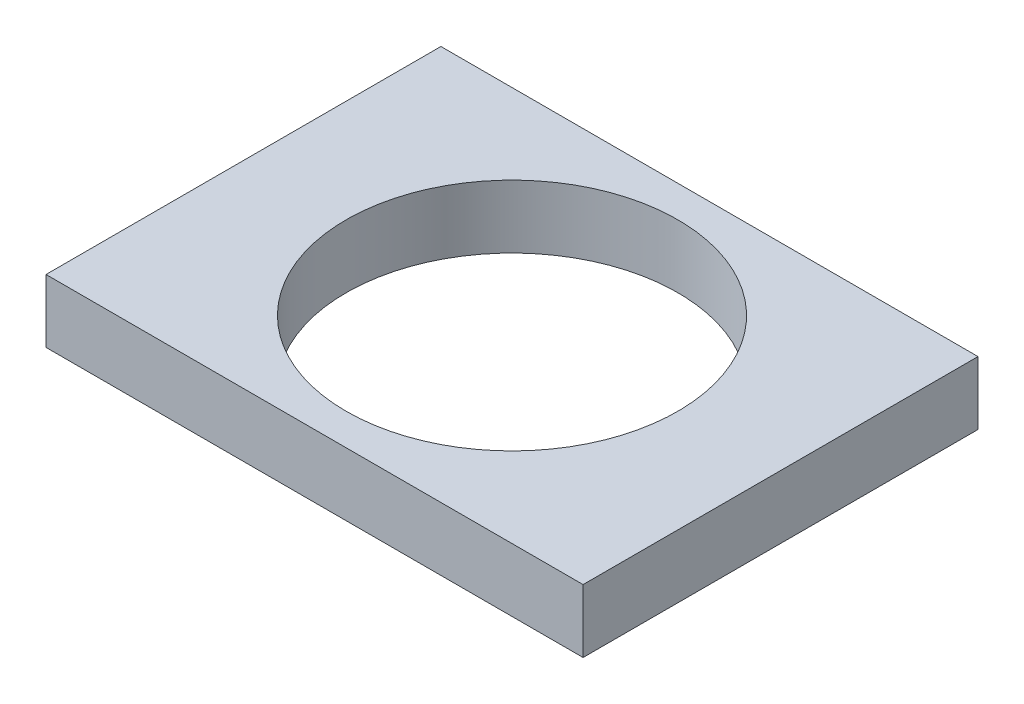
ISO-10303-21;
HEADER;
FILE_DESCRIPTION(('STEP AP214'),'2;1');
FILE_NAME('part.step','',(''),(''),'','','');
FILE_SCHEMA(('AUTOMOTIVE_DESIGN { 1 0 10303 214 1 1 1 1 }'));
ENDSEC;
DATA;
#1=APPLICATION_CONTEXT('core data for automotive mechanical design processes');
#2=APPLICATION_PROTOCOL_DEFINITION('international standard','automotive_design',2000,#1);
#3=PRODUCT_CONTEXT('',#1,'mechanical');
#4=PRODUCT('Part','Part','',(#3));
#5=PRODUCT_RELATED_PRODUCT_CATEGORY('part','',(#4));
#6=PRODUCT_DEFINITION_FORMATION('','',#4);
#7=PRODUCT_DEFINITION_CONTEXT('part definition',#1,'design');
#8=PRODUCT_DEFINITION('design','',#6,#7);
#9=PRODUCT_DEFINITION_SHAPE('','',#8);
#10=(LENGTH_UNIT() NAMED_UNIT(*) SI_UNIT(.MILLI.,.METRE.));
#11=(NAMED_UNIT(*) PLANE_ANGLE_UNIT() SI_UNIT($,.RADIAN.));
#12=(NAMED_UNIT(*) SI_UNIT($,.STERADIAN.) SOLID_ANGLE_UNIT());
#13=UNCERTAINTY_MEASURE_WITH_UNIT(LENGTH_MEASURE(1.E-05),#10,'distance_accuracy_value','');
#14=(GEOMETRIC_REPRESENTATION_CONTEXT(3) GLOBAL_UNCERTAINTY_ASSIGNED_CONTEXT((#13)) GLOBAL_UNIT_ASSIGNED_CONTEXT((#10,
#11,#12)) REPRESENTATION_CONTEXT('',''));
#15=CARTESIAN_POINT('',(0.,0.,0.));
#16=DIRECTION('',(0.,0.,1.));
#17=DIRECTION('',(1.,0.,0.));
#18=AXIS2_PLACEMENT_3D('',#15,#16,#17);
#19=CARTESIAN_POINT('',(0.,20.,0.));
#20=DIRECTION('',(0.,1.,0.));
#21=DIRECTION('',(0.,0.,1.));
#22=AXIS2_PLACEMENT_3D('',#19,#20,#21);
#23=PLANE('',#22);
#24=DIRECTION('',(1.,0.,0.));
#25=VECTOR('',#24,1.);
#26=CARTESIAN_POINT('',(-85.,20.,-62.5));
#27=LINE('',#26,#25);
#28=CARTESIAN_POINT('',(-85.,20.,-62.5));
#29=VERTEX_POINT('',#28);
#30=CARTESIAN_POINT('',(85.,20.,-62.5));
#31=VERTEX_POINT('',#30);
#32=EDGE_CURVE('E109',#29,#31,#27,.T.);
#33=ORIENTED_EDGE('',*,*,#32,.F.);
#34=DIRECTION('',(0.,0.,-1.));
#35=VECTOR('',#34,1.);
#36=CARTESIAN_POINT('',(-85.,20.,62.5));
#37=LINE('',#36,#35);
#38=CARTESIAN_POINT('',(-85.,20.,62.5));
#39=VERTEX_POINT('',#38);
#40=EDGE_CURVE('E99',#39,#29,#37,.T.);
#41=ORIENTED_EDGE('',*,*,#40,.F.);
#42=DIRECTION('',(1.,0.,0.));
#43=VECTOR('',#42,1.);
#44=CARTESIAN_POINT('',(-85.,20.,62.5));
#45=LINE('',#44,#43);
#46=CARTESIAN_POINT('',(85.,20.,62.5));
#47=VERTEX_POINT('',#46);
#48=EDGE_CURVE('E96',#39,#47,#45,.T.);
#49=ORIENTED_EDGE('',*,*,#48,.T.);
#50=DIRECTION('',(0.,0.,-1.));
#51=VECTOR('',#50,1.);
#52=CARTESIAN_POINT('',(85.,20.,62.5));
#53=LINE('',#52,#51);
#54=EDGE_CURVE('E93',#47,#31,#53,.T.);
#55=ORIENTED_EDGE('',*,*,#54,.T.);
#56=EDGE_LOOP('',(#33,#41,#49,#55));
#57=FACE_BOUND('',#56,.T.);
#58=CARTESIAN_POINT('',(0.,20.,0.));
#59=DIRECTION('',(0.,1.,0.));
#60=DIRECTION('',(0.,0.,1.));
#61=AXIS2_PLACEMENT_3D('',#58,#59,#60);
#62=CIRCLE('',#61,52.5);
#63=CARTESIAN_POINT('',(0.,20.,52.5));
#64=VERTEX_POINT('',#63);
#65=EDGE_CURVE('E120',#64,#64,#62,.T.);
#66=ORIENTED_EDGE('',*,*,#65,.F.);
#67=EDGE_LOOP('',(#66));
#68=FACE_BOUND('',#67,.T.);
#69=ADVANCED_FACE('F50',(#57,#68),#23,.T.);
#70=CARTESIAN_POINT('',(0.,0.,0.));
#71=DIRECTION('',(0.,1.,0.));
#72=DIRECTION('',(0.,0.,1.));
#73=AXIS2_PLACEMENT_3D('',#70,#71,#72);
#74=PLANE('',#73);
#75=DIRECTION('',(1.,0.,0.));
#76=VECTOR('',#75,1.);
#77=CARTESIAN_POINT('',(-85.,0.,-62.5));
#78=LINE('',#77,#76);
#79=CARTESIAN_POINT('',(-85.,0.,-62.5));
#80=VERTEX_POINT('',#79);
#81=CARTESIAN_POINT('',(85.,0.,-62.5));
#82=VERTEX_POINT('',#81);
#83=EDGE_CURVE('E116',#80,#82,#78,.T.);
#84=ORIENTED_EDGE('',*,*,#83,.T.);
#85=DIRECTION('',(0.,0.,-1.));
#86=VECTOR('',#85,1.);
#87=CARTESIAN_POINT('',(85.,0.,62.5));
#88=LINE('',#87,#86);
#89=CARTESIAN_POINT('',(85.,0.,62.5));
#90=VERTEX_POINT('',#89);
#91=EDGE_CURVE('E119',#90,#82,#88,.T.);
#92=ORIENTED_EDGE('',*,*,#91,.F.);
#93=DIRECTION('',(1.,0.,0.));
#94=VECTOR('',#93,1.);
#95=CARTESIAN_POINT('',(-85.,0.,62.5));
#96=LINE('',#95,#94);
#97=CARTESIAN_POINT('',(-85.,0.,62.5));
#98=VERTEX_POINT('',#97);
#99=EDGE_CURVE('E104',#98,#90,#96,.T.);
#100=ORIENTED_EDGE('',*,*,#99,.F.);
#101=DIRECTION('',(0.,0.,-1.));
#102=VECTOR('',#101,1.);
#103=CARTESIAN_POINT('',(-85.,0.,62.5));
#104=LINE('',#103,#102);
#105=EDGE_CURVE('E111',#98,#80,#104,.T.);
#106=ORIENTED_EDGE('',*,*,#105,.T.);
#107=EDGE_LOOP('',(#84,#92,#100,#106));
#108=FACE_BOUND('',#107,.T.);
#109=CARTESIAN_POINT('',(0.,0.,0.));
#110=DIRECTION('',(0.,1.,0.));
#111=DIRECTION('',(0.,0.,1.));
#112=AXIS2_PLACEMENT_3D('',#109,#110,#111);
#113=CIRCLE('',#112,52.5);
#114=CARTESIAN_POINT('',(0.,0.,52.5));
#115=VERTEX_POINT('',#114);
#116=EDGE_CURVE('E154',#115,#115,#113,.T.);
#117=ORIENTED_EDGE('',*,*,#116,.T.);
#118=EDGE_LOOP('',(#117));
#119=FACE_BOUND('',#118,.T.);
#120=ADVANCED_FACE('F126',(#108,#119),#74,.F.);
#121=CARTESIAN_POINT('',(-85.,20.,-62.5));
#122=DIRECTION('',(0.,0.,-1.));
#123=DIRECTION('',(-1.,0.,0.));
#124=AXIS2_PLACEMENT_3D('',#121,#122,#123);
#125=PLANE('',#124);
#126=ORIENTED_EDGE('',*,*,#83,.F.);
#127=DIRECTION('',(0.,-1.,0.));
#128=VECTOR('',#127,1.);
#129=CARTESIAN_POINT('',(-85.,20.,-62.5));
#130=LINE('',#129,#128);
#131=EDGE_CURVE('E12',#29,#80,#130,.T.);
#132=ORIENTED_EDGE('',*,*,#131,.F.);
#133=ORIENTED_EDGE('',*,*,#32,.T.);
#134=DIRECTION('',(0.,-1.,0.));
#135=VECTOR('',#134,1.);
#136=CARTESIAN_POINT('',(85.,20.,-62.5));
#137=LINE('',#136,#135);
#138=EDGE_CURVE('E54',#31,#82,#137,.T.);
#139=ORIENTED_EDGE('',*,*,#138,.T.);
#140=EDGE_LOOP('',(#126,#132,#133,#139));
#141=FACE_BOUND('',#140,.T.);
#142=ADVANCED_FACE('F52',(#141),#125,.T.);
#143=CARTESIAN_POINT('',(-85.,20.,62.5));
#144=DIRECTION('',(-1.,0.,0.));
#145=DIRECTION('',(0.,0.,1.));
#146=AXIS2_PLACEMENT_3D('',#143,#144,#145);
#147=PLANE('',#146);
#148=ORIENTED_EDGE('',*,*,#105,.F.);
#149=DIRECTION('',(0.,-1.,0.));
#150=VECTOR('',#149,1.);
#151=CARTESIAN_POINT('',(-85.,20.,62.5));
#152=LINE('',#151,#150);
#153=EDGE_CURVE('E60',#39,#98,#152,.T.);
#154=ORIENTED_EDGE('',*,*,#153,.F.);
#155=ORIENTED_EDGE('',*,*,#40,.T.);
#156=ORIENTED_EDGE('',*,*,#131,.T.);
#157=EDGE_LOOP('',(#148,#154,#155,#156));
#158=FACE_BOUND('',#157,.T.);
#159=ADVANCED_FACE('F128',(#158),#147,.T.);
#160=CARTESIAN_POINT('',(-85.,20.,62.5));
#161=DIRECTION('',(0.,0.,-1.));
#162=DIRECTION('',(-1.,0.,0.));
#163=AXIS2_PLACEMENT_3D('',#160,#161,#162);
#164=PLANE('',#163);
#165=ORIENTED_EDGE('',*,*,#99,.T.);
#166=DIRECTION('',(0.,-1.,0.));
#167=VECTOR('',#166,1.);
#168=CARTESIAN_POINT('',(85.,20.,62.5));
#169=LINE('',#168,#167);
#170=EDGE_CURVE('E102',#47,#90,#169,.T.);
#171=ORIENTED_EDGE('',*,*,#170,.F.);
#172=ORIENTED_EDGE('',*,*,#48,.F.);
#173=ORIENTED_EDGE('',*,*,#153,.T.);
#174=EDGE_LOOP('',(#165,#171,#172,#173));
#175=FACE_BOUND('',#174,.T.);
#176=ADVANCED_FACE('F103',(#175),#164,.F.);
#177=CARTESIAN_POINT('',(85.,20.,62.5));
#178=DIRECTION('',(-1.,0.,0.));
#179=DIRECTION('',(0.,0.,1.));
#180=AXIS2_PLACEMENT_3D('',#177,#178,#179);
#181=PLANE('',#180);
#182=ORIENTED_EDGE('',*,*,#91,.T.);
#183=ORIENTED_EDGE('',*,*,#138,.F.);
#184=ORIENTED_EDGE('',*,*,#54,.F.);
#185=ORIENTED_EDGE('',*,*,#170,.T.);
#186=EDGE_LOOP('',(#182,#183,#184,#185));
#187=FACE_BOUND('',#186,.T.);
#188=ADVANCED_FACE('F108',(#187),#181,.F.);
#189=CARTESIAN_POINT('',(0.,20.,0.));
#190=DIRECTION('',(0.,-1.,0.));
#191=DIRECTION('',(0.,0.,-1.));
#192=AXIS2_PLACEMENT_3D('',#189,#190,#191);
#193=CYLINDRICAL_SURFACE('',#192,52.5);
#194=ORIENTED_EDGE('',*,*,#65,.T.);
#195=EDGE_LOOP('',(#194));
#196=FACE_BOUND('',#195,.T.);
#197=ORIENTED_EDGE('',*,*,#116,.F.);
#198=EDGE_LOOP('',(#197));
#199=FACE_BOUND('',#198,.T.);
#200=ADVANCED_FACE('F143',(#196,#199),#193,.F.);
#201=CLOSED_SHELL('',(#69,#120,#142,#159,#176,#188,#200));
#202=MANIFOLD_SOLID_BREP('B2',#201);
#203=ADVANCED_BREP_SHAPE_REPRESENTATION('',(#18,#202),#14);
#204=SHAPE_DEFINITION_REPRESENTATION(#9,#203);
ENDSEC;
END-ISO-10303-21;
